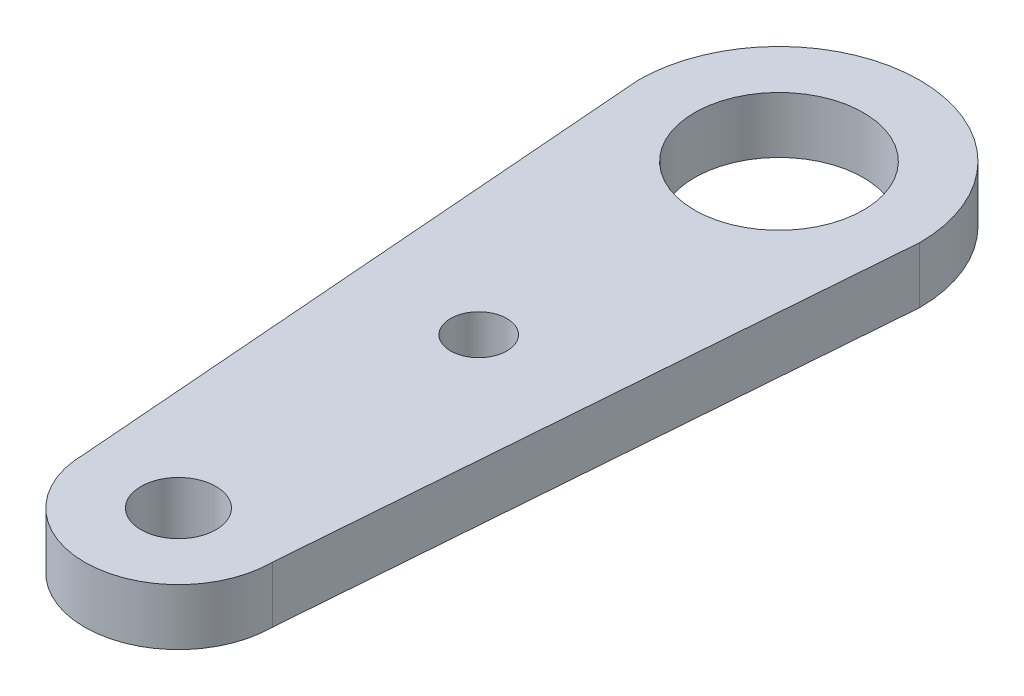
ISO-10303-21;
HEADER;
FILE_DESCRIPTION(('STEP AP214'),'2;1');
FILE_NAME('part.step','',(''),(''),'','','');
FILE_SCHEMA(('AUTOMOTIVE_DESIGN { 1 0 10303 214 1 1 1 1 }'));
ENDSEC;
DATA;
#1=APPLICATION_CONTEXT('core data for automotive mechanical design processes');
#2=APPLICATION_PROTOCOL_DEFINITION('international standard','automotive_design',2000,#1);
#3=PRODUCT_CONTEXT('',#1,'mechanical');
#4=PRODUCT('Part','Part','',(#3));
#5=PRODUCT_RELATED_PRODUCT_CATEGORY('part','',(#4));
#6=PRODUCT_DEFINITION_FORMATION('','',#4);
#7=PRODUCT_DEFINITION_CONTEXT('part definition',#1,'design');
#8=PRODUCT_DEFINITION('design','',#6,#7);
#9=PRODUCT_DEFINITION_SHAPE('','',#8);
#10=(LENGTH_UNIT() NAMED_UNIT(*) SI_UNIT(.MILLI.,.METRE.));
#11=(NAMED_UNIT(*) PLANE_ANGLE_UNIT() SI_UNIT($,.RADIAN.));
#12=(NAMED_UNIT(*) SI_UNIT($,.STERADIAN.) SOLID_ANGLE_UNIT());
#13=UNCERTAINTY_MEASURE_WITH_UNIT(LENGTH_MEASURE(1.E-05),#10,'distance_accuracy_value','');
#14=(GEOMETRIC_REPRESENTATION_CONTEXT(3) GLOBAL_UNCERTAINTY_ASSIGNED_CONTEXT((#13)) GLOBAL_UNIT_ASSIGNED_CONTEXT((#10,
#11,#12)) REPRESENTATION_CONTEXT('',''));
#15=CARTESIAN_POINT('',(0.,0.,0.));
#16=DIRECTION('',(0.,0.,1.));
#17=DIRECTION('',(1.,0.,0.));
#18=AXIS2_PLACEMENT_3D('',#15,#16,#17);
#19=CARTESIAN_POINT('',(4.96966755641835,3.,0.388255277845183));
#20=DIRECTION('',(0.996962141349243,0.,0.0778876672929096));
#21=DIRECTION('',(0.0778876672929096,0.,-0.996962141349244));
#22=AXIS2_PLACEMENT_3D('',#19,#20,#21);
#23=PLANE('',#22);
#24=DIRECTION('',(-0.0778876672929096,0.,0.996962141349244));
#25=VECTOR('',#24,1.);
#26=CARTESIAN_POINT('',(4.96966755641835,0.,0.388255277845183));
#27=LINE('',#26,#25);
#28=CARTESIAN_POINT('',(7.5,0.,-32.));
#29=VERTEX_POINT('',#28);
#30=CARTESIAN_POINT('',(5.,0.,0.));
#31=VERTEX_POINT('',#30);
#32=EDGE_CURVE('E115',#29,#31,#27,.T.);
#33=ORIENTED_EDGE('',*,*,#32,.F.);
#34=DIRECTION('',(0.,-1.,0.));
#35=VECTOR('',#34,1.);
#36=CARTESIAN_POINT('',(7.5,3.,-32.));
#37=LINE('',#36,#35);
#38=CARTESIAN_POINT('',(7.5,3.,-32.));
#39=VERTEX_POINT('',#38);
#40=EDGE_CURVE('E11',#39,#29,#37,.T.);
#41=ORIENTED_EDGE('',*,*,#40,.F.);
#42=DIRECTION('',(-0.0778876672929096,0.,0.996962141349244));
#43=VECTOR('',#42,1.);
#44=CARTESIAN_POINT('',(4.96966755641835,3.,0.388255277845183));
#45=LINE('',#44,#43);
#46=CARTESIAN_POINT('',(5.,3.,0.));
#47=VERTEX_POINT('',#46);
#48=EDGE_CURVE('E97',#39,#47,#45,.T.);
#49=ORIENTED_EDGE('',*,*,#48,.T.);
#50=DIRECTION('',(0.,-1.,0.));
#51=VECTOR('',#50,1.);
#52=CARTESIAN_POINT('',(5.,3.,0.));
#53=LINE('',#52,#51);
#54=EDGE_CURVE('E78',#47,#31,#53,.T.);
#55=ORIENTED_EDGE('',*,*,#54,.T.);
#56=EDGE_LOOP('',(#33,#41,#49,#55));
#57=FACE_BOUND('',#56,.T.);
#58=ADVANCED_FACE('F39',(#57),#23,.T.);
#59=CARTESIAN_POINT('',(0.,3.,-32.));
#60=DIRECTION('',(0.,-1.,0.));
#61=DIRECTION('',(0.,0.,-1.));
#62=AXIS2_PLACEMENT_3D('',#59,#60,#61);
#63=CYLINDRICAL_SURFACE('',#62,7.5);
#64=CARTESIAN_POINT('',(0.,0.,-32.));
#65=DIRECTION('',(0.,1.,0.));
#66=DIRECTION('',(0.,0.,1.));
#67=AXIS2_PLACEMENT_3D('',#64,#65,#66);
#68=CIRCLE('',#67,7.5);
#69=CARTESIAN_POINT('',(-7.5,0.,-32.));
#70=VERTEX_POINT('',#69);
#71=EDGE_CURVE('E102',#29,#70,#68,.T.);
#72=ORIENTED_EDGE('',*,*,#71,.T.);
#73=DIRECTION('',(0.,-1.,0.));
#74=VECTOR('',#73,1.);
#75=CARTESIAN_POINT('',(-7.5,3.,-32.));
#76=LINE('',#75,#74);
#77=CARTESIAN_POINT('',(-7.5,3.,-32.));
#78=VERTEX_POINT('',#77);
#79=EDGE_CURVE('E48',#78,#70,#76,.T.);
#80=ORIENTED_EDGE('',*,*,#79,.F.);
#81=CARTESIAN_POINT('',(0.,3.,-32.));
#82=DIRECTION('',(0.,1.,0.));
#83=DIRECTION('',(0.,0.,1.));
#84=AXIS2_PLACEMENT_3D('',#81,#82,#83);
#85=CIRCLE('',#84,7.5);
#86=EDGE_CURVE('E93',#39,#78,#85,.T.);
#87=ORIENTED_EDGE('',*,*,#86,.F.);
#88=ORIENTED_EDGE('',*,*,#40,.T.);
#89=EDGE_LOOP('',(#72,#80,#87,#88));
#90=FACE_BOUND('',#89,.T.);
#91=ADVANCED_FACE('F100',(#90),#63,.T.);
#92=CARTESIAN_POINT('',(-4.96966755641835,3.,0.388255277845183));
#93=DIRECTION('',(0.996962141349243,0.,-0.0778876672929096));
#94=DIRECTION('',(-0.0778876672929096,0.,-0.996962141349244));
#95=AXIS2_PLACEMENT_3D('',#92,#93,#94);
#96=PLANE('',#95);
#97=DIRECTION('',(0.0778876672929096,0.,0.996962141349244));
#98=VECTOR('',#97,1.);
#99=CARTESIAN_POINT('',(-4.96966755641835,0.,0.388255277845183));
#100=LINE('',#99,#98);
#101=CARTESIAN_POINT('',(-5.,0.,0.));
#102=VERTEX_POINT('',#101);
#103=EDGE_CURVE('E112',#70,#102,#100,.T.);
#104=ORIENTED_EDGE('',*,*,#103,.T.);
#105=DIRECTION('',(0.,-1.,0.));
#106=VECTOR('',#105,1.);
#107=CARTESIAN_POINT('',(-5.,3.,0.));
#108=LINE('',#107,#106);
#109=CARTESIAN_POINT('',(-5.,3.,0.));
#110=VERTEX_POINT('',#109);
#111=EDGE_CURVE('E92',#110,#102,#108,.T.);
#112=ORIENTED_EDGE('',*,*,#111,.F.);
#113=DIRECTION('',(0.0778876672929096,0.,0.996962141349244));
#114=VECTOR('',#113,1.);
#115=CARTESIAN_POINT('',(-4.96966755641835,3.,0.388255277845183));
#116=LINE('',#115,#114);
#117=EDGE_CURVE('E86',#78,#110,#116,.T.);
#118=ORIENTED_EDGE('',*,*,#117,.F.);
#119=ORIENTED_EDGE('',*,*,#79,.T.);
#120=EDGE_LOOP('',(#104,#112,#118,#119));
#121=FACE_BOUND('',#120,.T.);
#122=ADVANCED_FACE('F89',(#121),#96,.F.);
#123=CARTESIAN_POINT('',(0.,3.,0.));
#124=DIRECTION('',(0.,-1.,0.));
#125=DIRECTION('',(0.,0.,-1.));
#126=AXIS2_PLACEMENT_3D('',#123,#124,#125);
#127=CYLINDRICAL_SURFACE('',#126,5.);
#128=CARTESIAN_POINT('',(0.,0.,0.));
#129=DIRECTION('',(0.,1.,0.));
#130=DIRECTION('',(0.,0.,1.));
#131=AXIS2_PLACEMENT_3D('',#128,#129,#130);
#132=CIRCLE('',#131,5.);
#133=EDGE_CURVE('E71',#102,#31,#132,.T.);
#134=ORIENTED_EDGE('',*,*,#133,.T.);
#135=ORIENTED_EDGE('',*,*,#54,.F.);
#136=CARTESIAN_POINT('',(0.,3.,0.));
#137=DIRECTION('',(0.,1.,0.));
#138=DIRECTION('',(0.,0.,1.));
#139=AXIS2_PLACEMENT_3D('',#136,#137,#138);
#140=CIRCLE('',#139,5.);
#141=EDGE_CURVE('E56',#110,#47,#140,.T.);
#142=ORIENTED_EDGE('',*,*,#141,.F.);
#143=ORIENTED_EDGE('',*,*,#111,.T.);
#144=EDGE_LOOP('',(#134,#135,#142,#143));
#145=FACE_BOUND('',#144,.T.);
#146=ADVANCED_FACE('F150',(#145),#127,.T.);
#147=CARTESIAN_POINT('',(0.,3.,-32.));
#148=DIRECTION('',(0.,-1.,0.));
#149=DIRECTION('',(0.,0.,-1.));
#150=AXIS2_PLACEMENT_3D('',#147,#148,#149);
#151=CYLINDRICAL_SURFACE('',#150,4.5);
#152=CARTESIAN_POINT('',(0.,3.,-32.));
#153=DIRECTION('',(0.,1.,0.));
#154=DIRECTION('',(0.,0.,1.));
#155=AXIS2_PLACEMENT_3D('',#152,#153,#154);
#156=CIRCLE('',#155,4.5);
#157=CARTESIAN_POINT('',(0.,3.,-27.5));
#158=VERTEX_POINT('',#157);
#159=EDGE_CURVE('E110',#158,#158,#156,.T.);
#160=ORIENTED_EDGE('',*,*,#159,.T.);
#161=EDGE_LOOP('',(#160));
#162=FACE_BOUND('',#161,.T.);
#163=CARTESIAN_POINT('',(0.,0.,-32.));
#164=DIRECTION('',(0.,1.,0.));
#165=DIRECTION('',(0.,0.,1.));
#166=AXIS2_PLACEMENT_3D('',#163,#164,#165);
#167=CIRCLE('',#166,4.5);
#168=CARTESIAN_POINT('',(0.,0.,-27.5));
#169=VERTEX_POINT('',#168);
#170=EDGE_CURVE('E117',#169,#169,#167,.T.);
#171=ORIENTED_EDGE('',*,*,#170,.F.);
#172=EDGE_LOOP('',(#171));
#173=FACE_BOUND('',#172,.T.);
#174=ADVANCED_FACE('F41',(#162,#173),#151,.F.);
#175=CARTESIAN_POINT('',(0.,3.,0.));
#176=DIRECTION('',(0.,-1.,0.));
#177=DIRECTION('',(0.,0.,-1.));
#178=AXIS2_PLACEMENT_3D('',#175,#176,#177);
#179=CYLINDRICAL_SURFACE('',#178,2.);
#180=CARTESIAN_POINT('',(0.,3.,0.));
#181=DIRECTION('',(0.,1.,0.));
#182=DIRECTION('',(0.,0.,1.));
#183=AXIS2_PLACEMENT_3D('',#180,#181,#182);
#184=CIRCLE('',#183,2.);
#185=CARTESIAN_POINT('',(0.,3.,2.));
#186=VERTEX_POINT('',#185);
#187=EDGE_CURVE('E106',#186,#186,#184,.T.);
#188=ORIENTED_EDGE('',*,*,#187,.T.);
#189=EDGE_LOOP('',(#188));
#190=FACE_BOUND('',#189,.T.);
#191=CARTESIAN_POINT('',(0.,0.,0.));
#192=DIRECTION('',(0.,1.,0.));
#193=DIRECTION('',(0.,0.,1.));
#194=AXIS2_PLACEMENT_3D('',#191,#192,#193);
#195=CIRCLE('',#194,2.);
#196=CARTESIAN_POINT('',(0.,0.,2.));
#197=VERTEX_POINT('',#196);
#198=EDGE_CURVE('E107',#197,#197,#195,.T.);
#199=ORIENTED_EDGE('',*,*,#198,.F.);
#200=EDGE_LOOP('',(#199));
#201=FACE_BOUND('',#200,.T.);
#202=ADVANCED_FACE('F144',(#190,#201),#179,.F.);
#203=CARTESIAN_POINT('',(0.,3.,0.));
#204=DIRECTION('',(0.,1.,0.));
#205=DIRECTION('',(0.,0.,1.));
#206=AXIS2_PLACEMENT_3D('',#203,#204,#205);
#207=PLANE('',#206);
#208=CARTESIAN_POINT('',(0.,3.,-16.));
#209=DIRECTION('',(0.,1.,0.));
#210=DIRECTION('',(0.,0.,1.));
#211=AXIS2_PLACEMENT_3D('',#208,#209,#210);
#212=CIRCLE('',#211,1.5);
#213=CARTESIAN_POINT('',(0.,3.,-14.5));
#214=VERTEX_POINT('',#213);
#215=EDGE_CURVE('E127',#214,#214,#212,.T.);
#216=ORIENTED_EDGE('',*,*,#215,.F.);
#217=EDGE_LOOP('',(#216));
#218=FACE_BOUND('',#217,.T.);
#219=ORIENTED_EDGE('',*,*,#159,.F.);
#220=EDGE_LOOP('',(#219));
#221=FACE_BOUND('',#220,.T.);
#222=ORIENTED_EDGE('',*,*,#48,.F.);
#223=ORIENTED_EDGE('',*,*,#86,.T.);
#224=ORIENTED_EDGE('',*,*,#117,.T.);
#225=ORIENTED_EDGE('',*,*,#141,.T.);
#226=EDGE_LOOP('',(#222,#223,#224,#225));
#227=FACE_BOUND('',#226,.T.);
#228=ORIENTED_EDGE('',*,*,#187,.F.);
#229=EDGE_LOOP('',(#228));
#230=FACE_BOUND('',#229,.T.);
#231=ADVANCED_FACE('F95',(#218,#221,#227,#230),#207,.T.);
#232=CARTESIAN_POINT('',(0.,0.,0.));
#233=DIRECTION('',(0.,1.,0.));
#234=DIRECTION('',(0.,0.,1.));
#235=AXIS2_PLACEMENT_3D('',#232,#233,#234);
#236=PLANE('',#235);
#237=CARTESIAN_POINT('',(0.,0.,-16.));
#238=DIRECTION('',(0.,1.,0.));
#239=DIRECTION('',(0.,0.,1.));
#240=AXIS2_PLACEMENT_3D('',#237,#238,#239);
#241=CIRCLE('',#240,1.5);
#242=CARTESIAN_POINT('',(0.,0.,-14.5));
#243=VERTEX_POINT('',#242);
#244=EDGE_CURVE('E120',#243,#243,#241,.T.);
#245=ORIENTED_EDGE('',*,*,#244,.T.);
#246=EDGE_LOOP('',(#245));
#247=FACE_BOUND('',#246,.T.);
#248=ORIENTED_EDGE('',*,*,#170,.T.);
#249=EDGE_LOOP('',(#248));
#250=FACE_BOUND('',#249,.T.);
#251=ORIENTED_EDGE('',*,*,#32,.T.);
#252=ORIENTED_EDGE('',*,*,#133,.F.);
#253=ORIENTED_EDGE('',*,*,#103,.F.);
#254=ORIENTED_EDGE('',*,*,#71,.F.);
#255=EDGE_LOOP('',(#251,#252,#253,#254));
#256=FACE_BOUND('',#255,.T.);
#257=ORIENTED_EDGE('',*,*,#198,.T.);
#258=EDGE_LOOP('',(#257));
#259=FACE_BOUND('',#258,.T.);
#260=ADVANCED_FACE('F133',(#247,#250,#256,#259),#236,.F.);
#261=CARTESIAN_POINT('',(0.,0.,-16.));
#262=DIRECTION('',(0.,1.,0.));
#263=DIRECTION('',(0.,0.,1.));
#264=AXIS2_PLACEMENT_3D('',#261,#262,#263);
#265=CYLINDRICAL_SURFACE('',#264,1.5);
#266=ORIENTED_EDGE('',*,*,#244,.F.);
#267=EDGE_LOOP('',(#266));
#268=FACE_BOUND('',#267,.T.);
#269=ORIENTED_EDGE('',*,*,#215,.T.);
#270=EDGE_LOOP('',(#269));
#271=FACE_BOUND('',#270,.T.);
#272=ADVANCED_FACE('F136',(#268,#271),#265,.F.);
#273=CLOSED_SHELL('',(#58,#91,#122,#146,#174,#202,#231,#260,#272));
#274=MANIFOLD_SOLID_BREP('B2',#273);
#275=ADVANCED_BREP_SHAPE_REPRESENTATION('',(#18,#274),#14);
#276=SHAPE_DEFINITION_REPRESENTATION(#9,#275);
ENDSEC;
END-ISO-10303-21;
